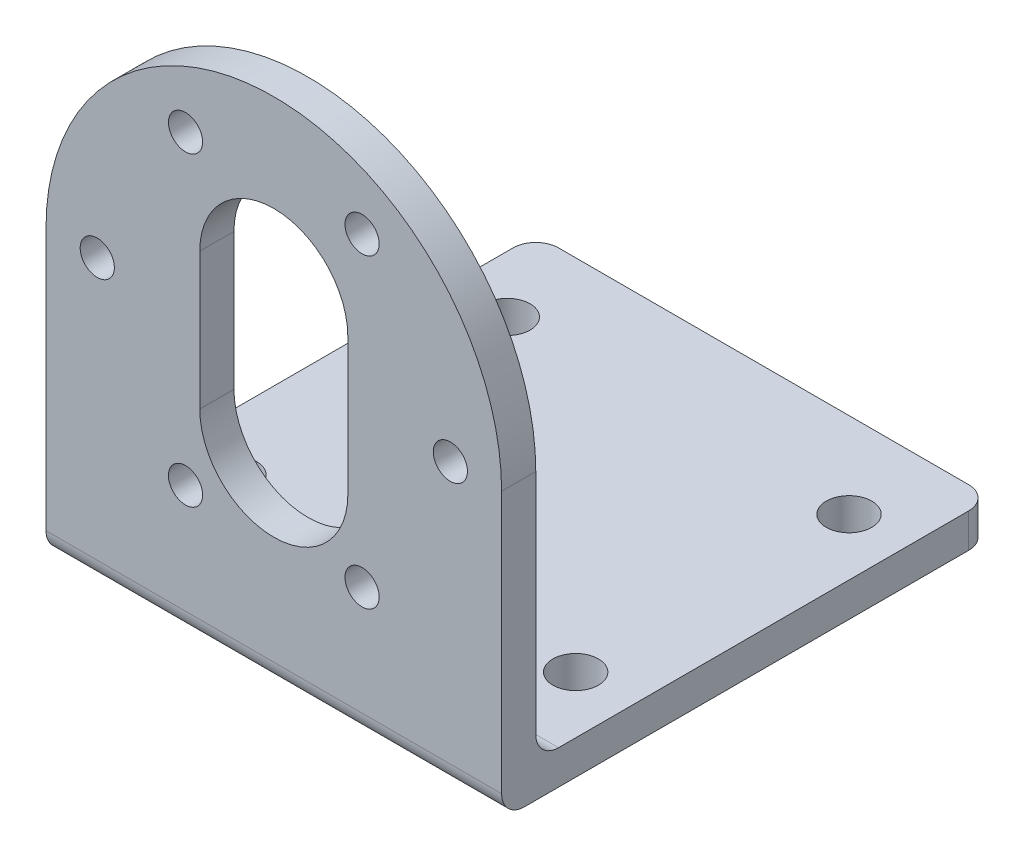
ISO-10303-21;
HEADER;
FILE_DESCRIPTION(('STEP AP214'),'2;1');
FILE_NAME('part.step','',(''),(''),'','','');
FILE_SCHEMA(('AUTOMOTIVE_DESIGN { 1 0 10303 214 1 1 1 1 }'));
ENDSEC;
DATA;
#1=APPLICATION_CONTEXT('core data for automotive mechanical design processes');
#2=APPLICATION_PROTOCOL_DEFINITION('international standard','automotive_design',2000,#1);
#3=PRODUCT_CONTEXT('',#1,'mechanical');
#4=PRODUCT('Part','Part','',(#3));
#5=PRODUCT_RELATED_PRODUCT_CATEGORY('part','',(#4));
#6=PRODUCT_DEFINITION_FORMATION('','',#4);
#7=PRODUCT_DEFINITION_CONTEXT('part definition',#1,'design');
#8=PRODUCT_DEFINITION('design','',#6,#7);
#9=PRODUCT_DEFINITION_SHAPE('','',#8);
#10=(LENGTH_UNIT() NAMED_UNIT(*) SI_UNIT(.MILLI.,.METRE.));
#11=(NAMED_UNIT(*) PLANE_ANGLE_UNIT() SI_UNIT($,.RADIAN.));
#12=(NAMED_UNIT(*) SI_UNIT($,.STERADIAN.) SOLID_ANGLE_UNIT());
#13=UNCERTAINTY_MEASURE_WITH_UNIT(LENGTH_MEASURE(1.E-05),#10,'distance_accuracy_value','');
#14=(GEOMETRIC_REPRESENTATION_CONTEXT(3) GLOBAL_UNCERTAINTY_ASSIGNED_CONTEXT((#13)) GLOBAL_UNIT_ASSIGNED_CONTEXT((#10,
#11,#12)) REPRESENTATION_CONTEXT('',''));
#15=CARTESIAN_POINT('',(0.,0.,0.));
#16=DIRECTION('',(0.,0.,1.));
#17=DIRECTION('',(1.,0.,0.));
#18=AXIS2_PLACEMENT_3D('',#15,#16,#17);
#19=CARTESIAN_POINT('',(0.,0.,3.));
#20=DIRECTION('',(0.,0.,1.));
#21=DIRECTION('',(1.,0.,0.));
#22=AXIS2_PLACEMENT_3D('',#19,#20,#21);
#23=PLANE('',#22);
#24=CARTESIAN_POINT('',(-15.5,-1.02427923060762E-13,3.));
#25=DIRECTION('',(0.,0.,1.));
#26=DIRECTION('',(1.,0.,0.));
#27=AXIS2_PLACEMENT_3D('',#24,#25,#26);
#28=CIRCLE('',#27,1.5000000000001);
#29=CARTESIAN_POINT('',(-13.9999999999999,-1.02427923060762E-13,3.));
#30=VERTEX_POINT('',#29);
#31=EDGE_CURVE('E219',#30,#30,#28,.T.);
#32=ORIENTED_EDGE('',*,*,#31,.F.);
#33=EDGE_LOOP('',(#32));
#34=FACE_BOUND('',#33,.T.);
#35=CARTESIAN_POINT('',(7.75000000000018,-13.4233937586587,3.));
#36=DIRECTION('',(0.,0.,1.));
#37=DIRECTION('',(1.,0.,0.));
#38=AXIS2_PLACEMENT_3D('',#35,#36,#37);
#39=CIRCLE('',#38,1.50000000000013);
#40=CARTESIAN_POINT('',(9.25000000000031,-13.4233937586587,3.));
#41=VERTEX_POINT('',#40);
#42=EDGE_CURVE('E231',#41,#41,#39,.T.);
#43=ORIENTED_EDGE('',*,*,#42,.F.);
#44=EDGE_LOOP('',(#43));
#45=FACE_BOUND('',#44,.T.);
#46=CARTESIAN_POINT('',(7.74999999999991,13.4233937586588,3.));
#47=DIRECTION('',(0.,0.,1.));
#48=DIRECTION('',(1.,0.,0.));
#49=AXIS2_PLACEMENT_3D('',#46,#47,#48);
#50=CIRCLE('',#49,1.5);
#51=CARTESIAN_POINT('',(9.24999999999992,13.4233937586588,3.));
#52=VERTEX_POINT('',#51);
#53=EDGE_CURVE('E243',#52,#52,#50,.T.);
#54=ORIENTED_EDGE('',*,*,#53,.F.);
#55=EDGE_LOOP('',(#54));
#56=FACE_BOUND('',#55,.T.);
#57=DIRECTION('',(0.,-1.,0.));
#58=VECTOR('',#57,1.);
#59=CARTESIAN_POINT('',(-20.,0.,3.));
#60=LINE('',#59,#58);
#61=CARTESIAN_POINT('',(-20.,0.,3.));
#62=VERTEX_POINT('',#61);
#63=CARTESIAN_POINT('',(-20.,-23.,3.));
#64=VERTEX_POINT('',#63);
#65=EDGE_CURVE('E252',#62,#64,#60,.T.);
#66=ORIENTED_EDGE('',*,*,#65,.T.);
#67=DIRECTION('',(1.,0.,0.));
#68=VECTOR('',#67,1.);
#69=CARTESIAN_POINT('',(20.,-23.,3.));
#70=LINE('',#69,#68);
#71=CARTESIAN_POINT('',(20.,-23.,3.));
#72=VERTEX_POINT('',#71);
#73=EDGE_CURVE('E278',#64,#72,#70,.T.);
#74=ORIENTED_EDGE('',*,*,#73,.T.);
#75=DIRECTION('',(0.,1.,0.));
#76=VECTOR('',#75,1.);
#77=CARTESIAN_POINT('',(20.,-25.,3.));
#78=LINE('',#77,#76);
#79=CARTESIAN_POINT('',(20.,0.,3.));
#80=VERTEX_POINT('',#79);
#81=EDGE_CURVE('E256',#72,#80,#78,.T.);
#82=ORIENTED_EDGE('',*,*,#81,.T.);
#83=CARTESIAN_POINT('',(0.,0.,3.));
#84=DIRECTION('',(0.,0.,1.));
#85=DIRECTION('',(1.,0.,0.));
#86=AXIS2_PLACEMENT_3D('',#83,#84,#85);
#87=CIRCLE('',#86,20.);
#88=EDGE_CURVE('E249',#80,#62,#87,.T.);
#89=ORIENTED_EDGE('',*,*,#88,.T.);
#90=EDGE_LOOP('',(#66,#74,#82,#89));
#91=FACE_BOUND('',#90,.T.);
#92=CARTESIAN_POINT('',(15.5,1.03700100773229E-13,3.));
#93=DIRECTION('',(0.,0.,1.));
#94=DIRECTION('',(1.,0.,0.));
#95=AXIS2_PLACEMENT_3D('',#92,#93,#94);
#96=CIRCLE('',#95,1.50000000000003);
#97=CARTESIAN_POINT('',(17.,1.03700100773229E-13,3.));
#98=VERTEX_POINT('',#97);
#99=EDGE_CURVE('E237',#98,#98,#96,.T.);
#100=ORIENTED_EDGE('',*,*,#99,.F.);
#101=EDGE_LOOP('',(#100));
#102=FACE_BOUND('',#101,.T.);
#103=CARTESIAN_POINT('',(-7.74999999999982,-13.4233937586589,3.));
#104=DIRECTION('',(0.,0.,1.));
#105=DIRECTION('',(1.,0.,0.));
#106=AXIS2_PLACEMENT_3D('',#103,#104,#105);
#107=CIRCLE('',#106,1.50000000000015);
#108=CARTESIAN_POINT('',(-6.24999999999967,-13.4233937586589,3.));
#109=VERTEX_POINT('',#108);
#110=EDGE_CURVE('E225',#109,#109,#107,.T.);
#111=ORIENTED_EDGE('',*,*,#110,.F.);
#112=EDGE_LOOP('',(#111));
#113=FACE_BOUND('',#112,.T.);
#114=CARTESIAN_POINT('',(-7.7500000000001,13.4233937586587,3.));
#115=DIRECTION('',(0.,0.,1.));
#116=DIRECTION('',(1.,0.,0.));
#117=AXIS2_PLACEMENT_3D('',#114,#115,#116);
#118=CIRCLE('',#117,1.50000000000013);
#119=CARTESIAN_POINT('',(-6.24999999999996,13.4233937586587,3.));
#120=VERTEX_POINT('',#119);
#121=EDGE_CURVE('E213',#120,#120,#118,.T.);
#122=ORIENTED_EDGE('',*,*,#121,.F.);
#123=EDGE_LOOP('',(#122));
#124=FACE_BOUND('',#123,.T.);
#125=DIRECTION('',(0.,-1.,0.));
#126=VECTOR('',#125,1.);
#127=CARTESIAN_POINT('',(-6.5,5.,3.));
#128=LINE('',#127,#126);
#129=CARTESIAN_POINT('',(-6.5,5.,3.));
#130=VERTEX_POINT('',#129);
#131=CARTESIAN_POINT('',(-6.5,-7.,3.));
#132=VERTEX_POINT('',#131);
#133=EDGE_CURVE('E184',#130,#132,#128,.T.);
#134=ORIENTED_EDGE('',*,*,#133,.F.);
#135=CARTESIAN_POINT('',(0.,5.,3.));
#136=DIRECTION('',(0.,0.,1.));
#137=DIRECTION('',(1.,0.,0.));
#138=AXIS2_PLACEMENT_3D('',#135,#136,#137);
#139=CIRCLE('',#138,6.5);
#140=CARTESIAN_POINT('',(6.5,5.,3.));
#141=VERTEX_POINT('',#140);
#142=EDGE_CURVE('E182',#141,#130,#139,.T.);
#143=ORIENTED_EDGE('',*,*,#142,.F.);
#144=DIRECTION('',(0.,1.,0.));
#145=VECTOR('',#144,1.);
#146=CARTESIAN_POINT('',(6.5,5.,3.));
#147=LINE('',#146,#145);
#148=CARTESIAN_POINT('',(6.5,-7.,3.));
#149=VERTEX_POINT('',#148);
#150=EDGE_CURVE('E190',#149,#141,#147,.T.);
#151=ORIENTED_EDGE('',*,*,#150,.F.);
#152=CARTESIAN_POINT('',(0.,-7.,3.));
#153=DIRECTION('',(0.,0.,1.));
#154=DIRECTION('',(1.,0.,0.));
#155=AXIS2_PLACEMENT_3D('',#152,#153,#154);
#156=CIRCLE('',#155,6.5);
#157=EDGE_CURVE('E187',#132,#149,#156,.T.);
#158=ORIENTED_EDGE('',*,*,#157,.F.);
#159=EDGE_LOOP('',(#134,#143,#151,#158));
#160=FACE_BOUND('',#159,.T.);
#161=ADVANCED_FACE('F36',(#34,#45,#56,#91,#102,#113,#124,#160),#23,.T.);
#162=CARTESIAN_POINT('',(0.,0.,0.));
#163=DIRECTION('',(0.,0.,1.));
#164=DIRECTION('',(1.,0.,0.));
#165=AXIS2_PLACEMENT_3D('',#162,#163,#164);
#166=PLANE('',#165);
#167=CARTESIAN_POINT('',(-7.7500000000001,13.4233937586587,0.));
#168=DIRECTION('',(0.,0.,1.));
#169=DIRECTION('',(1.,0.,0.));
#170=AXIS2_PLACEMENT_3D('',#167,#168,#169);
#171=CIRCLE('',#170,1.50000000000013);
#172=CARTESIAN_POINT('',(-6.24999999999996,13.4233937586587,0.));
#173=VERTEX_POINT('',#172);
#174=EDGE_CURVE('E212',#173,#173,#171,.T.);
#175=ORIENTED_EDGE('',*,*,#174,.T.);
#176=EDGE_LOOP('',(#175));
#177=FACE_BOUND('',#176,.T.);
#178=CARTESIAN_POINT('',(-15.5,-1.02427923060762E-13,0.));
#179=DIRECTION('',(0.,0.,1.));
#180=DIRECTION('',(1.,0.,0.));
#181=AXIS2_PLACEMENT_3D('',#178,#179,#180);
#182=CIRCLE('',#181,1.5000000000001);
#183=CARTESIAN_POINT('',(-13.9999999999999,-1.02427923060762E-13,0.));
#184=VERTEX_POINT('',#183);
#185=EDGE_CURVE('E216',#184,#184,#182,.T.);
#186=ORIENTED_EDGE('',*,*,#185,.T.);
#187=EDGE_LOOP('',(#186));
#188=FACE_BOUND('',#187,.T.);
#189=CARTESIAN_POINT('',(-7.74999999999982,-13.4233937586589,0.));
#190=DIRECTION('',(0.,0.,1.));
#191=DIRECTION('',(1.,0.,0.));
#192=AXIS2_PLACEMENT_3D('',#189,#190,#191);
#193=CIRCLE('',#192,1.50000000000015);
#194=CARTESIAN_POINT('',(-6.24999999999967,-13.4233937586589,0.));
#195=VERTEX_POINT('',#194);
#196=EDGE_CURVE('E222',#195,#195,#193,.T.);
#197=ORIENTED_EDGE('',*,*,#196,.T.);
#198=EDGE_LOOP('',(#197));
#199=FACE_BOUND('',#198,.T.);
#200=CARTESIAN_POINT('',(7.75000000000018,-13.4233937586587,0.));
#201=DIRECTION('',(0.,0.,1.));
#202=DIRECTION('',(1.,0.,0.));
#203=AXIS2_PLACEMENT_3D('',#200,#201,#202);
#204=CIRCLE('',#203,1.50000000000013);
#205=CARTESIAN_POINT('',(9.25000000000031,-13.4233937586587,0.));
#206=VERTEX_POINT('',#205);
#207=EDGE_CURVE('E228',#206,#206,#204,.T.);
#208=ORIENTED_EDGE('',*,*,#207,.T.);
#209=EDGE_LOOP('',(#208));
#210=FACE_BOUND('',#209,.T.);
#211=CARTESIAN_POINT('',(15.5,1.03700100773229E-13,0.));
#212=DIRECTION('',(0.,0.,1.));
#213=DIRECTION('',(1.,0.,0.));
#214=AXIS2_PLACEMENT_3D('',#211,#212,#213);
#215=CIRCLE('',#214,1.50000000000003);
#216=CARTESIAN_POINT('',(17.,1.03700100773229E-13,0.));
#217=VERTEX_POINT('',#216);
#218=EDGE_CURVE('E234',#217,#217,#215,.T.);
#219=ORIENTED_EDGE('',*,*,#218,.T.);
#220=EDGE_LOOP('',(#219));
#221=FACE_BOUND('',#220,.T.);
#222=CARTESIAN_POINT('',(7.74999999999991,13.4233937586588,0.));
#223=DIRECTION('',(0.,0.,1.));
#224=DIRECTION('',(1.,0.,0.));
#225=AXIS2_PLACEMENT_3D('',#222,#223,#224);
#226=CIRCLE('',#225,1.5);
#227=CARTESIAN_POINT('',(9.24999999999992,13.4233937586588,0.));
#228=VERTEX_POINT('',#227);
#229=EDGE_CURVE('E240',#228,#228,#226,.T.);
#230=ORIENTED_EDGE('',*,*,#229,.T.);
#231=EDGE_LOOP('',(#230));
#232=FACE_BOUND('',#231,.T.);
#233=DIRECTION('',(0.,1.,0.));
#234=VECTOR('',#233,1.);
#235=CARTESIAN_POINT('',(20.,-25.,0.));
#236=LINE('',#235,#234);
#237=CARTESIAN_POINT('',(20.,-20.,0.));
#238=VERTEX_POINT('',#237);
#239=CARTESIAN_POINT('',(20.,0.,0.));
#240=VERTEX_POINT('',#239);
#241=EDGE_CURVE('E253',#238,#240,#236,.T.);
#242=ORIENTED_EDGE('',*,*,#241,.F.);
#243=DIRECTION('',(-1.,0.,0.));
#244=VECTOR('',#243,1.);
#245=CARTESIAN_POINT('',(-20.,-20.,0.));
#246=LINE('',#245,#244);
#247=CARTESIAN_POINT('',(-20.,-20.,0.));
#248=VERTEX_POINT('',#247);
#249=EDGE_CURVE('E273',#238,#248,#246,.T.);
#250=ORIENTED_EDGE('',*,*,#249,.T.);
#251=DIRECTION('',(0.,-1.,0.));
#252=VECTOR('',#251,1.);
#253=CARTESIAN_POINT('',(-20.,0.,0.));
#254=LINE('',#253,#252);
#255=CARTESIAN_POINT('',(-20.,0.,0.));
#256=VERTEX_POINT('',#255);
#257=EDGE_CURVE('E261',#256,#248,#254,.T.);
#258=ORIENTED_EDGE('',*,*,#257,.F.);
#259=CARTESIAN_POINT('',(0.,0.,0.));
#260=DIRECTION('',(0.,0.,1.));
#261=DIRECTION('',(1.,0.,0.));
#262=AXIS2_PLACEMENT_3D('',#259,#260,#261);
#263=CIRCLE('',#262,20.);
#264=EDGE_CURVE('E246',#240,#256,#263,.T.);
#265=ORIENTED_EDGE('',*,*,#264,.F.);
#266=EDGE_LOOP('',(#242,#250,#258,#265));
#267=FACE_BOUND('',#266,.T.);
#268=CARTESIAN_POINT('',(0.,5.,0.));
#269=DIRECTION('',(0.,0.,1.));
#270=DIRECTION('',(1.,0.,0.));
#271=AXIS2_PLACEMENT_3D('',#268,#269,#270);
#272=CIRCLE('',#271,6.5);
#273=CARTESIAN_POINT('',(6.5,5.,0.));
#274=VERTEX_POINT('',#273);
#275=CARTESIAN_POINT('',(-6.5,5.,0.));
#276=VERTEX_POINT('',#275);
#277=EDGE_CURVE('E178',#274,#276,#272,.T.);
#278=ORIENTED_EDGE('',*,*,#277,.T.);
#279=DIRECTION('',(0.,-1.,0.));
#280=VECTOR('',#279,1.);
#281=CARTESIAN_POINT('',(-6.5,5.,0.));
#282=LINE('',#281,#280);
#283=CARTESIAN_POINT('',(-6.5,-7.,0.));
#284=VERTEX_POINT('',#283);
#285=EDGE_CURVE('E195',#276,#284,#282,.T.);
#286=ORIENTED_EDGE('',*,*,#285,.T.);
#287=CARTESIAN_POINT('',(0.,-7.,0.));
#288=DIRECTION('',(0.,0.,1.));
#289=DIRECTION('',(1.,0.,0.));
#290=AXIS2_PLACEMENT_3D('',#287,#288,#289);
#291=CIRCLE('',#290,6.5);
#292=CARTESIAN_POINT('',(6.5,-7.,0.));
#293=VERTEX_POINT('',#292);
#294=EDGE_CURVE('E198',#284,#293,#291,.T.);
#295=ORIENTED_EDGE('',*,*,#294,.T.);
#296=DIRECTION('',(0.,1.,0.));
#297=VECTOR('',#296,1.);
#298=CARTESIAN_POINT('',(6.5,5.,0.));
#299=LINE('',#298,#297);
#300=EDGE_CURVE('E185',#293,#274,#299,.T.);
#301=ORIENTED_EDGE('',*,*,#300,.T.);
#302=EDGE_LOOP('',(#278,#286,#295,#301));
#303=FACE_BOUND('',#302,.T.);
#304=ADVANCED_FACE('F299',(#177,#188,#199,#210,#221,#232,#267,#303),#166,.F.);
#305=CARTESIAN_POINT('',(0.,0.,3.));
#306=DIRECTION('',(0.,0.,-1.));
#307=DIRECTION('',(-1.,0.,0.));
#308=AXIS2_PLACEMENT_3D('',#305,#306,#307);
#309=CYLINDRICAL_SURFACE('',#308,20.);
#310=ORIENTED_EDGE('',*,*,#264,.T.);
#311=DIRECTION('',(0.,0.,-1.));
#312=VECTOR('',#311,1.);
#313=CARTESIAN_POINT('',(-20.,0.,3.));
#314=LINE('',#313,#312);
#315=EDGE_CURVE('E270',#62,#256,#314,.T.);
#316=ORIENTED_EDGE('',*,*,#315,.F.);
#317=ORIENTED_EDGE('',*,*,#88,.F.);
#318=DIRECTION('',(0.,0.,-1.));
#319=VECTOR('',#318,1.);
#320=CARTESIAN_POINT('',(20.,0.,3.));
#321=LINE('',#320,#319);
#322=EDGE_CURVE('E258',#80,#240,#321,.T.);
#323=ORIENTED_EDGE('',*,*,#322,.T.);
#324=EDGE_LOOP('',(#310,#316,#317,#323));
#325=FACE_BOUND('',#324,.T.);
#326=ADVANCED_FACE('F305',(#325),#309,.T.);
#327=CARTESIAN_POINT('',(-20.,0.,3.));
#328=DIRECTION('',(1.,0.,0.));
#329=DIRECTION('',(0.,1.,0.));
#330=AXIS2_PLACEMENT_3D('',#327,#328,#329);
#331=PLANE('',#330);
#332=DIRECTION('',(0.,0.,-1.));
#333=VECTOR('',#332,1.);
#334=CARTESIAN_POINT('',(-20.,-25.,3.));
#335=LINE('',#334,#333);
#336=CARTESIAN_POINT('',(-20.,-25.,1.));
#337=VERTEX_POINT('',#336);
#338=CARTESIAN_POINT('',(-20.,-25.,-38.));
#339=VERTEX_POINT('',#338);
#340=EDGE_CURVE('E268',#337,#339,#335,.T.);
#341=ORIENTED_EDGE('',*,*,#340,.F.);
#342=CARTESIAN_POINT('',(-20.,-23.,1.));
#343=DIRECTION('',(1.,0.,0.));
#344=DIRECTION('',(0.,1.,0.));
#345=AXIS2_PLACEMENT_3D('',#342,#343,#344);
#346=CIRCLE('',#345,2.);
#347=EDGE_CURVE('E283',#337,#64,#346,.F.);
#348=ORIENTED_EDGE('',*,*,#347,.T.);
#349=ORIENTED_EDGE('',*,*,#65,.F.);
#350=ORIENTED_EDGE('',*,*,#315,.T.);
#351=ORIENTED_EDGE('',*,*,#257,.T.);
#352=CARTESIAN_POINT('',(-20.,-20.,-2.));
#353=DIRECTION('',(1.,0.,0.));
#354=DIRECTION('',(0.,1.,0.));
#355=AXIS2_PLACEMENT_3D('',#352,#353,#354);
#356=CIRCLE('',#355,2.);
#357=CARTESIAN_POINT('',(-20.,-22.,-2.));
#358=VERTEX_POINT('',#357);
#359=EDGE_CURVE('E44',#248,#358,#356,.T.);
#360=ORIENTED_EDGE('',*,*,#359,.T.);
#361=DIRECTION('',(0.,0.,-1.));
#362=VECTOR('',#361,1.);
#363=CARTESIAN_POINT('',(-20.,-22.,0.));
#364=LINE('',#363,#362);
#365=CARTESIAN_POINT('',(-20.,-22.,-38.));
#366=VERTEX_POINT('',#365);
#367=EDGE_CURVE('E136',#358,#366,#364,.T.);
#368=ORIENTED_EDGE('',*,*,#367,.T.);
#369=DIRECTION('',(0.,-1.,0.));
#370=VECTOR('',#369,1.);
#371=CARTESIAN_POINT('',(-20.,-22.,-38.));
#372=LINE('',#371,#370);
#373=EDGE_CURVE('E139',#366,#339,#372,.T.);
#374=ORIENTED_EDGE('',*,*,#373,.T.);
#375=EDGE_LOOP('',(#341,#348,#349,#350,#351,#360,#368,#374));
#376=FACE_BOUND('',#375,.T.);
#377=ADVANCED_FACE('F138',(#376),#331,.F.);
#378=CARTESIAN_POINT('',(-20.,-25.,3.));
#379=DIRECTION('',(0.,1.,0.));
#380=DIRECTION('',(0.,0.,1.));
#381=AXIS2_PLACEMENT_3D('',#378,#379,#380);
#382=PLANE('',#381);
#383=DIRECTION('',(0.,0.,-1.));
#384=VECTOR('',#383,1.);
#385=CARTESIAN_POINT('',(20.,-25.,3.));
#386=LINE('',#385,#384);
#387=CARTESIAN_POINT('',(20.,-25.,1.));
#388=VERTEX_POINT('',#387);
#389=CARTESIAN_POINT('',(20.,-25.,-38.));
#390=VERTEX_POINT('',#389);
#391=EDGE_CURVE('E266',#388,#390,#386,.T.);
#392=ORIENTED_EDGE('',*,*,#391,.F.);
#393=DIRECTION('',(1.,0.,0.));
#394=VECTOR('',#393,1.);
#395=CARTESIAN_POINT('',(-20.,-25.,1.));
#396=LINE('',#395,#394);
#397=EDGE_CURVE('E51',#388,#337,#396,.F.);
#398=ORIENTED_EDGE('',*,*,#397,.T.);
#399=ORIENTED_EDGE('',*,*,#340,.T.);
#400=CARTESIAN_POINT('',(-18.,-25.,-38.));
#401=DIRECTION('',(0.,-1.,0.));
#402=DIRECTION('',(0.,0.,1.));
#403=AXIS2_PLACEMENT_3D('',#400,#401,#402);
#404=CIRCLE('',#403,2.);
#405=CARTESIAN_POINT('',(-18.,-25.,-40.));
#406=VERTEX_POINT('',#405);
#407=EDGE_CURVE('E152',#339,#406,#404,.T.);
#408=ORIENTED_EDGE('',*,*,#407,.T.);
#409=DIRECTION('',(1.,0.,0.));
#410=VECTOR('',#409,1.);
#411=CARTESIAN_POINT('',(18.,-25.,-40.));
#412=LINE('',#411,#410);
#413=CARTESIAN_POINT('',(18.,-25.,-40.));
#414=VERTEX_POINT('',#413);
#415=EDGE_CURVE('E168',#406,#414,#412,.T.);
#416=ORIENTED_EDGE('',*,*,#415,.T.);
#417=CARTESIAN_POINT('',(18.,-25.,-38.));
#418=DIRECTION('',(0.,-1.,0.));
#419=DIRECTION('',(0.,0.,-1.));
#420=AXIS2_PLACEMENT_3D('',#417,#418,#419);
#421=CIRCLE('',#420,2.);
#422=EDGE_CURVE('E172',#414,#390,#421,.T.);
#423=ORIENTED_EDGE('',*,*,#422,.T.);
#424=EDGE_LOOP('',(#392,#398,#399,#408,#416,#423));
#425=FACE_BOUND('',#424,.T.);
#426=CARTESIAN_POINT('',(15.,-25.,-8.5));
#427=DIRECTION('',(0.,-1.,0.));
#428=DIRECTION('',(0.,0.,-1.));
#429=AXIS2_PLACEMENT_3D('',#426,#427,#428);
#430=CIRCLE('',#429,2.);
#431=CARTESIAN_POINT('',(15.,-25.,-10.5));
#432=VERTEX_POINT('',#431);
#433=EDGE_CURVE('E354',#432,#432,#430,.T.);
#434=ORIENTED_EDGE('',*,*,#433,.F.);
#435=EDGE_LOOP('',(#434));
#436=FACE_BOUND('',#435,.T.);
#437=CARTESIAN_POINT('',(15.,-25.,-32.5));
#438=DIRECTION('',(0.,-1.,0.));
#439=DIRECTION('',(0.,0.,1.));
#440=AXIS2_PLACEMENT_3D('',#437,#438,#439);
#441=CIRCLE('',#440,2.);
#442=CARTESIAN_POINT('',(15.,-25.,-30.5));
#443=VERTEX_POINT('',#442);
#444=EDGE_CURVE('E348',#443,#443,#441,.T.);
#445=ORIENTED_EDGE('',*,*,#444,.F.);
#446=EDGE_LOOP('',(#445));
#447=FACE_BOUND('',#446,.T.);
#448=CARTESIAN_POINT('',(-15.,-25.,-8.5));
#449=DIRECTION('',(0.,-1.,0.));
#450=DIRECTION('',(0.,0.,1.));
#451=AXIS2_PLACEMENT_3D('',#448,#449,#450);
#452=CIRCLE('',#451,2.);
#453=CARTESIAN_POINT('',(-15.,-25.,-6.5));
#454=VERTEX_POINT('',#453);
#455=EDGE_CURVE('E342',#454,#454,#452,.T.);
#456=ORIENTED_EDGE('',*,*,#455,.F.);
#457=EDGE_LOOP('',(#456));
#458=FACE_BOUND('',#457,.T.);
#459=CARTESIAN_POINT('',(-15.,-25.,-32.5));
#460=DIRECTION('',(0.,-1.,0.));
#461=DIRECTION('',(0.,0.,-1.));
#462=AXIS2_PLACEMENT_3D('',#459,#460,#461);
#463=CIRCLE('',#462,2.);
#464=CARTESIAN_POINT('',(-15.,-25.,-34.5));
#465=VERTEX_POINT('',#464);
#466=EDGE_CURVE('E336',#465,#465,#463,.T.);
#467=ORIENTED_EDGE('',*,*,#466,.F.);
#468=EDGE_LOOP('',(#467));
#469=FACE_BOUND('',#468,.T.);
#470=ADVANCED_FACE('F317',(#425,#436,#447,#458,#469),#382,.F.);
#471=CARTESIAN_POINT('',(20.,-25.,3.));
#472=DIRECTION('',(-1.,0.,0.));
#473=DIRECTION('',(0.,-1.,0.));
#474=AXIS2_PLACEMENT_3D('',#471,#472,#473);
#475=PLANE('',#474);
#476=ORIENTED_EDGE('',*,*,#81,.F.);
#477=CARTESIAN_POINT('',(20.,-23.,1.));
#478=DIRECTION('',(-1.,0.,0.));
#479=DIRECTION('',(0.,-1.,0.));
#480=AXIS2_PLACEMENT_3D('',#477,#478,#479);
#481=CIRCLE('',#480,2.);
#482=EDGE_CURVE('E59',#72,#388,#481,.F.);
#483=ORIENTED_EDGE('',*,*,#482,.T.);
#484=ORIENTED_EDGE('',*,*,#391,.T.);
#485=DIRECTION('',(0.,-1.,0.));
#486=VECTOR('',#485,1.);
#487=CARTESIAN_POINT('',(20.,-22.,-38.));
#488=LINE('',#487,#486);
#489=CARTESIAN_POINT('',(20.,-22.,-38.));
#490=VERTEX_POINT('',#489);
#491=EDGE_CURVE('E175',#490,#390,#488,.T.);
#492=ORIENTED_EDGE('',*,*,#491,.F.);
#493=DIRECTION('',(0.,0.,1.));
#494=VECTOR('',#493,1.);
#495=CARTESIAN_POINT('',(20.,-22.,0.));
#496=LINE('',#495,#494);
#497=CARTESIAN_POINT('',(20.,-22.,-2.));
#498=VERTEX_POINT('',#497);
#499=EDGE_CURVE('E146',#490,#498,#496,.T.);
#500=ORIENTED_EDGE('',*,*,#499,.T.);
#501=CARTESIAN_POINT('',(20.,-20.,-2.));
#502=DIRECTION('',(-1.,0.,0.));
#503=DIRECTION('',(0.,-1.,0.));
#504=AXIS2_PLACEMENT_3D('',#501,#502,#503);
#505=CIRCLE('',#504,2.);
#506=EDGE_CURVE('E11',#498,#238,#505,.T.);
#507=ORIENTED_EDGE('',*,*,#506,.T.);
#508=ORIENTED_EDGE('',*,*,#241,.T.);
#509=ORIENTED_EDGE('',*,*,#322,.F.);
#510=EDGE_LOOP('',(#476,#483,#484,#492,#500,#507,#508,#509));
#511=FACE_BOUND('',#510,.T.);
#512=ADVANCED_FACE('F314',(#511),#475,.F.);
#513=CARTESIAN_POINT('',(7.74999999999991,13.4233937586588,3.));
#514=DIRECTION('',(0.,0.,-1.));
#515=DIRECTION('',(-1.,0.,0.));
#516=AXIS2_PLACEMENT_3D('',#513,#514,#515);
#517=CYLINDRICAL_SURFACE('',#516,1.5);
#518=ORIENTED_EDGE('',*,*,#53,.T.);
#519=EDGE_LOOP('',(#518));
#520=FACE_BOUND('',#519,.T.);
#521=ORIENTED_EDGE('',*,*,#229,.F.);
#522=EDGE_LOOP('',(#521));
#523=FACE_BOUND('',#522,.T.);
#524=ADVANCED_FACE('F311',(#520,#523),#517,.F.);
#525=CARTESIAN_POINT('',(15.5,1.03700100773229E-13,3.));
#526=DIRECTION('',(0.,0.,-1.));
#527=DIRECTION('',(-1.,0.,0.));
#528=AXIS2_PLACEMENT_3D('',#525,#526,#527);
#529=CYLINDRICAL_SURFACE('',#528,1.50000000000003);
#530=ORIENTED_EDGE('',*,*,#99,.T.);
#531=EDGE_LOOP('',(#530));
#532=FACE_BOUND('',#531,.T.);
#533=ORIENTED_EDGE('',*,*,#218,.F.);
#534=EDGE_LOOP('',(#533));
#535=FACE_BOUND('',#534,.T.);
#536=ADVANCED_FACE('F430',(#532,#535),#529,.F.);
#537=CARTESIAN_POINT('',(7.75000000000018,-13.4233937586587,3.));
#538=DIRECTION('',(0.,0.,-1.));
#539=DIRECTION('',(-1.,0.,0.));
#540=AXIS2_PLACEMENT_3D('',#537,#538,#539);
#541=CYLINDRICAL_SURFACE('',#540,1.50000000000013);
#542=ORIENTED_EDGE('',*,*,#42,.T.);
#543=EDGE_LOOP('',(#542));
#544=FACE_BOUND('',#543,.T.);
#545=ORIENTED_EDGE('',*,*,#207,.F.);
#546=EDGE_LOOP('',(#545));
#547=FACE_BOUND('',#546,.T.);
#548=ADVANCED_FACE('F427',(#544,#547),#541,.F.);
#549=CARTESIAN_POINT('',(-7.74999999999982,-13.4233937586589,3.));
#550=DIRECTION('',(0.,0.,-1.));
#551=DIRECTION('',(-1.,0.,0.));
#552=AXIS2_PLACEMENT_3D('',#549,#550,#551);
#553=CYLINDRICAL_SURFACE('',#552,1.50000000000015);
#554=ORIENTED_EDGE('',*,*,#110,.T.);
#555=EDGE_LOOP('',(#554));
#556=FACE_BOUND('',#555,.T.);
#557=ORIENTED_EDGE('',*,*,#196,.F.);
#558=EDGE_LOOP('',(#557));
#559=FACE_BOUND('',#558,.T.);
#560=ADVANCED_FACE('F423',(#556,#559),#553,.F.);
#561=CARTESIAN_POINT('',(-15.5,-1.02427923060762E-13,3.));
#562=DIRECTION('',(0.,0.,-1.));
#563=DIRECTION('',(-1.,0.,0.));
#564=AXIS2_PLACEMENT_3D('',#561,#562,#563);
#565=CYLINDRICAL_SURFACE('',#564,1.5000000000001);
#566=ORIENTED_EDGE('',*,*,#31,.T.);
#567=EDGE_LOOP('',(#566));
#568=FACE_BOUND('',#567,.T.);
#569=ORIENTED_EDGE('',*,*,#185,.F.);
#570=EDGE_LOOP('',(#569));
#571=FACE_BOUND('',#570,.T.);
#572=ADVANCED_FACE('F419',(#568,#571),#565,.F.);
#573=CARTESIAN_POINT('',(-7.7500000000001,13.4233937586587,3.));
#574=DIRECTION('',(0.,0.,-1.));
#575=DIRECTION('',(-1.,0.,0.));
#576=AXIS2_PLACEMENT_3D('',#573,#574,#575);
#577=CYLINDRICAL_SURFACE('',#576,1.50000000000013);
#578=ORIENTED_EDGE('',*,*,#121,.T.);
#579=EDGE_LOOP('',(#578));
#580=FACE_BOUND('',#579,.T.);
#581=ORIENTED_EDGE('',*,*,#174,.F.);
#582=EDGE_LOOP('',(#581));
#583=FACE_BOUND('',#582,.T.);
#584=ADVANCED_FACE('F415',(#580,#583),#577,.F.);
#585=CARTESIAN_POINT('',(0.,5.,3.));
#586=DIRECTION('',(0.,0.,-1.));
#587=DIRECTION('',(-1.,0.,0.));
#588=AXIS2_PLACEMENT_3D('',#585,#586,#587);
#589=CYLINDRICAL_SURFACE('',#588,6.5);
#590=ORIENTED_EDGE('',*,*,#277,.F.);
#591=DIRECTION('',(0.,0.,-1.));
#592=VECTOR('',#591,1.);
#593=CARTESIAN_POINT('',(6.5,5.,3.));
#594=LINE('',#593,#592);
#595=EDGE_CURVE('E192',#141,#274,#594,.T.);
#596=ORIENTED_EDGE('',*,*,#595,.F.);
#597=ORIENTED_EDGE('',*,*,#142,.T.);
#598=DIRECTION('',(0.,0.,-1.));
#599=VECTOR('',#598,1.);
#600=CARTESIAN_POINT('',(-6.5,5.,3.));
#601=LINE('',#600,#599);
#602=EDGE_CURVE('E209',#130,#276,#601,.T.);
#603=ORIENTED_EDGE('',*,*,#602,.T.);
#604=EDGE_LOOP('',(#590,#596,#597,#603));
#605=FACE_BOUND('',#604,.T.);
#606=ADVANCED_FACE('F411',(#605),#589,.F.);
#607=CARTESIAN_POINT('',(-6.5,5.,3.));
#608=DIRECTION('',(1.,0.,0.));
#609=DIRECTION('',(0.,0.,-1.));
#610=AXIS2_PLACEMENT_3D('',#607,#608,#609);
#611=PLANE('',#610);
#612=ORIENTED_EDGE('',*,*,#285,.F.);
#613=ORIENTED_EDGE('',*,*,#602,.F.);
#614=ORIENTED_EDGE('',*,*,#133,.T.);
#615=DIRECTION('',(0.,0.,-1.));
#616=VECTOR('',#615,1.);
#617=CARTESIAN_POINT('',(-6.5,-7.,3.));
#618=LINE('',#617,#616);
#619=EDGE_CURVE('E207',#132,#284,#618,.T.);
#620=ORIENTED_EDGE('',*,*,#619,.T.);
#621=EDGE_LOOP('',(#612,#613,#614,#620));
#622=FACE_BOUND('',#621,.T.);
#623=ADVANCED_FACE('F407',(#622),#611,.T.);
#624=CARTESIAN_POINT('',(0.,-7.,3.));
#625=DIRECTION('',(0.,0.,-1.));
#626=DIRECTION('',(-1.,0.,0.));
#627=AXIS2_PLACEMENT_3D('',#624,#625,#626);
#628=CYLINDRICAL_SURFACE('',#627,6.5);
#629=ORIENTED_EDGE('',*,*,#294,.F.);
#630=ORIENTED_EDGE('',*,*,#619,.F.);
#631=ORIENTED_EDGE('',*,*,#157,.T.);
#632=DIRECTION('',(0.,0.,-1.));
#633=VECTOR('',#632,1.);
#634=CARTESIAN_POINT('',(6.5,-7.,3.));
#635=LINE('',#634,#633);
#636=EDGE_CURVE('E205',#149,#293,#635,.T.);
#637=ORIENTED_EDGE('',*,*,#636,.T.);
#638=EDGE_LOOP('',(#629,#630,#631,#637));
#639=FACE_BOUND('',#638,.T.);
#640=ADVANCED_FACE('F403',(#639),#628,.F.);
#641=CARTESIAN_POINT('',(6.5,5.,3.));
#642=DIRECTION('',(-1.,0.,0.));
#643=DIRECTION('',(0.,-1.,0.));
#644=AXIS2_PLACEMENT_3D('',#641,#642,#643);
#645=PLANE('',#644);
#646=ORIENTED_EDGE('',*,*,#300,.F.);
#647=ORIENTED_EDGE('',*,*,#636,.F.);
#648=ORIENTED_EDGE('',*,*,#150,.T.);
#649=ORIENTED_EDGE('',*,*,#595,.T.);
#650=EDGE_LOOP('',(#646,#647,#648,#649));
#651=FACE_BOUND('',#650,.T.);
#652=ADVANCED_FACE('F394',(#651),#645,.T.);
#653=CARTESIAN_POINT('',(18.,-22.,-38.));
#654=DIRECTION('',(0.,-1.,0.));
#655=DIRECTION('',(0.,0.,-1.));
#656=AXIS2_PLACEMENT_3D('',#653,#654,#655);
#657=CYLINDRICAL_SURFACE('',#656,2.);
#658=ORIENTED_EDGE('',*,*,#422,.F.);
#659=DIRECTION('',(0.,-1.,0.));
#660=VECTOR('',#659,1.);
#661=CARTESIAN_POINT('',(18.,-22.,-40.));
#662=LINE('',#661,#660);
#663=CARTESIAN_POINT('',(18.,-22.,-40.));
#664=VERTEX_POINT('',#663);
#665=EDGE_CURVE('E179',#664,#414,#662,.T.);
#666=ORIENTED_EDGE('',*,*,#665,.F.);
#667=CARTESIAN_POINT('',(18.,-22.,-38.));
#668=DIRECTION('',(0.,-1.,0.));
#669=DIRECTION('',(0.,0.,-1.));
#670=AXIS2_PLACEMENT_3D('',#667,#668,#669);
#671=CIRCLE('',#670,2.);
#672=EDGE_CURVE('E154',#664,#490,#671,.T.);
#673=ORIENTED_EDGE('',*,*,#672,.T.);
#674=ORIENTED_EDGE('',*,*,#491,.T.);
#675=EDGE_LOOP('',(#658,#666,#673,#674));
#676=FACE_BOUND('',#675,.T.);
#677=ADVANCED_FACE('F390',(#676),#657,.T.);
#678=CARTESIAN_POINT('',(18.,-22.,-40.));
#679=DIRECTION('',(0.,0.,-1.));
#680=DIRECTION('',(-1.,0.,0.));
#681=AXIS2_PLACEMENT_3D('',#678,#679,#680);
#682=PLANE('',#681);
#683=ORIENTED_EDGE('',*,*,#415,.F.);
#684=DIRECTION('',(0.,-1.,0.));
#685=VECTOR('',#684,1.);
#686=CARTESIAN_POINT('',(-18.,-22.,-40.));
#687=LINE('',#686,#685);
#688=CARTESIAN_POINT('',(-18.,-22.,-40.));
#689=VERTEX_POINT('',#688);
#690=EDGE_CURVE('E153',#689,#406,#687,.T.);
#691=ORIENTED_EDGE('',*,*,#690,.F.);
#692=DIRECTION('',(1.,0.,0.));
#693=VECTOR('',#692,1.);
#694=CARTESIAN_POINT('',(18.,-22.,-40.));
#695=LINE('',#694,#693);
#696=EDGE_CURVE('E160',#689,#664,#695,.T.);
#697=ORIENTED_EDGE('',*,*,#696,.T.);
#698=ORIENTED_EDGE('',*,*,#665,.T.);
#699=EDGE_LOOP('',(#683,#691,#697,#698));
#700=FACE_BOUND('',#699,.T.);
#701=ADVANCED_FACE('F393',(#700),#682,.T.);
#702=CARTESIAN_POINT('',(-18.,-22.,-38.));
#703=DIRECTION('',(0.,-1.,0.));
#704=DIRECTION('',(0.,0.,-1.));
#705=AXIS2_PLACEMENT_3D('',#702,#703,#704);
#706=CYLINDRICAL_SURFACE('',#705,2.);
#707=ORIENTED_EDGE('',*,*,#407,.F.);
#708=ORIENTED_EDGE('',*,*,#373,.F.);
#709=CARTESIAN_POINT('',(-18.,-22.,-38.));
#710=DIRECTION('',(0.,-1.,0.));
#711=DIRECTION('',(0.,0.,1.));
#712=AXIS2_PLACEMENT_3D('',#709,#710,#711);
#713=CIRCLE('',#712,2.);
#714=EDGE_CURVE('E145',#366,#689,#713,.T.);
#715=ORIENTED_EDGE('',*,*,#714,.T.);
#716=ORIENTED_EDGE('',*,*,#690,.T.);
#717=EDGE_LOOP('',(#707,#708,#715,#716));
#718=FACE_BOUND('',#717,.T.);
#719=ADVANCED_FACE('F150',(#718),#706,.T.);
#720=CARTESIAN_POINT('',(18.,-22.,-38.));
#721=DIRECTION('',(0.,-1.,0.));
#722=DIRECTION('',(0.,0.,-1.));
#723=AXIS2_PLACEMENT_3D('',#720,#721,#722);
#724=PLANE('',#723);
#725=CARTESIAN_POINT('',(15.,-22.,-8.5));
#726=DIRECTION('',(0.,-1.,0.));
#727=DIRECTION('',(0.,0.,-1.));
#728=AXIS2_PLACEMENT_3D('',#725,#726,#727);
#729=CIRCLE('',#728,2.);
#730=CARTESIAN_POINT('',(15.,-22.,-10.5));
#731=VERTEX_POINT('',#730);
#732=EDGE_CURVE('E351',#731,#731,#729,.T.);
#733=ORIENTED_EDGE('',*,*,#732,.T.);
#734=EDGE_LOOP('',(#733));
#735=FACE_BOUND('',#734,.T.);
#736=CARTESIAN_POINT('',(15.,-22.,-32.5));
#737=DIRECTION('',(0.,-1.,0.));
#738=DIRECTION('',(0.,0.,1.));
#739=AXIS2_PLACEMENT_3D('',#736,#737,#738);
#740=CIRCLE('',#739,2.);
#741=CARTESIAN_POINT('',(15.,-22.,-30.5));
#742=VERTEX_POINT('',#741);
#743=EDGE_CURVE('E345',#742,#742,#740,.T.);
#744=ORIENTED_EDGE('',*,*,#743,.T.);
#745=EDGE_LOOP('',(#744));
#746=FACE_BOUND('',#745,.T.);
#747=CARTESIAN_POINT('',(-15.,-22.,-8.5));
#748=DIRECTION('',(0.,-1.,0.));
#749=DIRECTION('',(0.,0.,1.));
#750=AXIS2_PLACEMENT_3D('',#747,#748,#749);
#751=CIRCLE('',#750,2.);
#752=CARTESIAN_POINT('',(-15.,-22.,-6.5));
#753=VERTEX_POINT('',#752);
#754=EDGE_CURVE('E339',#753,#753,#751,.T.);
#755=ORIENTED_EDGE('',*,*,#754,.T.);
#756=EDGE_LOOP('',(#755));
#757=FACE_BOUND('',#756,.T.);
#758=CARTESIAN_POINT('',(-15.,-22.,-32.5));
#759=DIRECTION('',(0.,-1.,0.));
#760=DIRECTION('',(0.,0.,-1.));
#761=AXIS2_PLACEMENT_3D('',#758,#759,#760);
#762=CIRCLE('',#761,2.);
#763=CARTESIAN_POINT('',(-15.,-22.,-34.5));
#764=VERTEX_POINT('',#763);
#765=EDGE_CURVE('E169',#764,#764,#762,.T.);
#766=ORIENTED_EDGE('',*,*,#765,.T.);
#767=EDGE_LOOP('',(#766));
#768=FACE_BOUND('',#767,.T.);
#769=ORIENTED_EDGE('',*,*,#367,.F.);
#770=DIRECTION('',(-1.,0.,0.));
#771=VECTOR('',#770,1.);
#772=CARTESIAN_POINT('',(20.,-22.,-2.));
#773=LINE('',#772,#771);
#774=EDGE_CURVE('E276',#358,#498,#773,.F.);
#775=ORIENTED_EDGE('',*,*,#774,.T.);
#776=ORIENTED_EDGE('',*,*,#499,.F.);
#777=ORIENTED_EDGE('',*,*,#672,.F.);
#778=ORIENTED_EDGE('',*,*,#696,.F.);
#779=ORIENTED_EDGE('',*,*,#714,.F.);
#780=EDGE_LOOP('',(#769,#775,#776,#777,#778,#779));
#781=FACE_BOUND('',#780,.T.);
#782=ADVANCED_FACE('F157',(#735,#746,#757,#768,#781),#724,.F.);
#783=CARTESIAN_POINT('',(-15.,-22.,-32.5));
#784=DIRECTION('',(0.,-1.,0.));
#785=DIRECTION('',(0.,0.,-1.));
#786=AXIS2_PLACEMENT_3D('',#783,#784,#785);
#787=CYLINDRICAL_SURFACE('',#786,2.);
#788=ORIENTED_EDGE('',*,*,#765,.F.);
#789=EDGE_LOOP('',(#788));
#790=FACE_BOUND('',#789,.T.);
#791=ORIENTED_EDGE('',*,*,#466,.T.);
#792=EDGE_LOOP('',(#791));
#793=FACE_BOUND('',#792,.T.);
#794=ADVANCED_FACE('F375',(#790,#793),#787,.F.);
#795=CARTESIAN_POINT('',(-15.,-22.,-8.5));
#796=DIRECTION('',(0.,-1.,0.));
#797=DIRECTION('',(0.,0.,-1.));
#798=AXIS2_PLACEMENT_3D('',#795,#796,#797);
#799=CYLINDRICAL_SURFACE('',#798,2.);
#800=ORIENTED_EDGE('',*,*,#754,.F.);
#801=EDGE_LOOP('',(#800));
#802=FACE_BOUND('',#801,.T.);
#803=ORIENTED_EDGE('',*,*,#455,.T.);
#804=EDGE_LOOP('',(#803));
#805=FACE_BOUND('',#804,.T.);
#806=ADVANCED_FACE('F377',(#802,#805),#799,.F.);
#807=CARTESIAN_POINT('',(15.,-22.,-32.5));
#808=DIRECTION('',(0.,-1.,0.));
#809=DIRECTION('',(0.,0.,-1.));
#810=AXIS2_PLACEMENT_3D('',#807,#808,#809);
#811=CYLINDRICAL_SURFACE('',#810,2.);
#812=ORIENTED_EDGE('',*,*,#743,.F.);
#813=EDGE_LOOP('',(#812));
#814=FACE_BOUND('',#813,.T.);
#815=ORIENTED_EDGE('',*,*,#444,.T.);
#816=EDGE_LOOP('',(#815));
#817=FACE_BOUND('',#816,.T.);
#818=ADVANCED_FACE('F364',(#814,#817),#811,.F.);
#819=CARTESIAN_POINT('',(15.,-22.,-8.5));
#820=DIRECTION('',(0.,-1.,0.));
#821=DIRECTION('',(0.,0.,-1.));
#822=AXIS2_PLACEMENT_3D('',#819,#820,#821);
#823=CYLINDRICAL_SURFACE('',#822,2.);
#824=ORIENTED_EDGE('',*,*,#732,.F.);
#825=EDGE_LOOP('',(#824));
#826=FACE_BOUND('',#825,.T.);
#827=ORIENTED_EDGE('',*,*,#433,.T.);
#828=EDGE_LOOP('',(#827));
#829=FACE_BOUND('',#828,.T.);
#830=ADVANCED_FACE('F296',(#826,#829),#823,.F.);
#831=CARTESIAN_POINT('',(0.,-20.,-2.));
#832=DIRECTION('',(1.,0.,0.));
#833=DIRECTION('',(0.,0.,-1.));
#834=AXIS2_PLACEMENT_3D('',#831,#832,#833);
#835=CYLINDRICAL_SURFACE('',#834,2.);
#836=ORIENTED_EDGE('',*,*,#506,.F.);
#837=ORIENTED_EDGE('',*,*,#774,.F.);
#838=ORIENTED_EDGE('',*,*,#359,.F.);
#839=ORIENTED_EDGE('',*,*,#249,.F.);
#840=EDGE_LOOP('',(#836,#837,#838,#839));
#841=FACE_BOUND('',#840,.T.);
#842=ADVANCED_FACE('F292',(#841),#835,.F.);
#843=CARTESIAN_POINT('',(0.,-23.,1.));
#844=DIRECTION('',(-1.,0.,0.));
#845=DIRECTION('',(0.,0.,1.));
#846=AXIS2_PLACEMENT_3D('',#843,#844,#845);
#847=CYLINDRICAL_SURFACE('',#846,2.);
#848=ORIENTED_EDGE('',*,*,#347,.F.);
#849=ORIENTED_EDGE('',*,*,#397,.F.);
#850=ORIENTED_EDGE('',*,*,#482,.F.);
#851=ORIENTED_EDGE('',*,*,#73,.F.);
#852=EDGE_LOOP('',(#848,#849,#850,#851));
#853=FACE_BOUND('',#852,.T.);
#854=ADVANCED_FACE('F38',(#853),#847,.T.);
#855=CLOSED_SHELL('',(#161,#304,#326,#377,#470,#512,#524,#536,#548,#560,#572,#584,#606,#623,
#640,#652,#677,#701,#719,#782,#794,#806,#818,#830,#842,#854));
#856=MANIFOLD_SOLID_BREP('B2',#855);
#857=ADVANCED_BREP_SHAPE_REPRESENTATION('',(#18,#856),#14);
#858=SHAPE_DEFINITION_REPRESENTATION(#9,#857);
ENDSEC;
END-ISO-10303-21;
